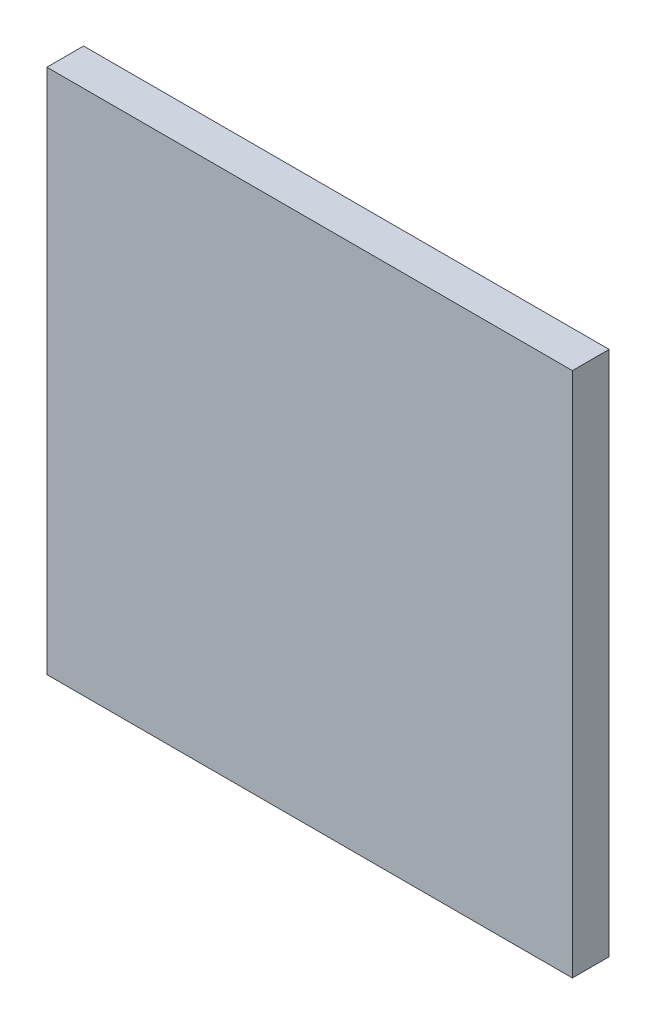
ISO-10303-21;
HEADER;
FILE_DESCRIPTION(('STEP AP214'),'2;1');
FILE_NAME('part.step','',(''),(''),'','','');
FILE_SCHEMA(('AUTOMOTIVE_DESIGN { 1 0 10303 214 1 1 1 1 }'));
ENDSEC;
DATA;
#1=APPLICATION_CONTEXT('core data for automotive mechanical design processes');
#2=APPLICATION_PROTOCOL_DEFINITION('international standard','automotive_design',2000,#1);
#3=PRODUCT_CONTEXT('',#1,'mechanical');
#4=PRODUCT('Part','Part','',(#3));
#5=PRODUCT_RELATED_PRODUCT_CATEGORY('part','',(#4));
#6=PRODUCT_DEFINITION_FORMATION('','',#4);
#7=PRODUCT_DEFINITION_CONTEXT('part definition',#1,'design');
#8=PRODUCT_DEFINITION('design','',#6,#7);
#9=PRODUCT_DEFINITION_SHAPE('','',#8);
#10=(LENGTH_UNIT() NAMED_UNIT(*) SI_UNIT(.MILLI.,.METRE.));
#11=(NAMED_UNIT(*) PLANE_ANGLE_UNIT() SI_UNIT($,.RADIAN.));
#12=(NAMED_UNIT(*) SI_UNIT($,.STERADIAN.) SOLID_ANGLE_UNIT());
#13=UNCERTAINTY_MEASURE_WITH_UNIT(LENGTH_MEASURE(1.E-05),#10,'distance_accuracy_value','');
#14=(GEOMETRIC_REPRESENTATION_CONTEXT(3) GLOBAL_UNCERTAINTY_ASSIGNED_CONTEXT((#13)) GLOBAL_UNIT_ASSIGNED_CONTEXT((#10,
#11,#12)) REPRESENTATION_CONTEXT('',''));
#15=CARTESIAN_POINT('',(0.,0.,0.));
#16=DIRECTION('',(0.,0.,1.));
#17=DIRECTION('',(1.,0.,0.));
#18=AXIS2_PLACEMENT_3D('',#15,#16,#17);
#19=CARTESIAN_POINT('',(1.655,0.8675,0.48));
#20=DIRECTION('',(0.,0.,1.));
#21=DIRECTION('',(1.,0.,0.));
#22=AXIS2_PLACEMENT_3D('',#19,#20,#21);
#23=PLANE('',#22);
#24=DIRECTION('',(0.,1.,0.));
#25=VECTOR('',#24,1.);
#26=CARTESIAN_POINT('',(6.665,0.8675,0.48));
#27=LINE('',#26,#25);
#28=CARTESIAN_POINT('',(6.665,5.8825,0.48));
#29=VERTEX_POINT('',#28);
#30=CARTESIAN_POINT('',(6.665,0.8675,0.48));
#31=VERTEX_POINT('',#30);
#32=EDGE_CURVE('E76',#29,#31,#27,.F.);
#33=ORIENTED_EDGE('',*,*,#32,.F.);
#34=DIRECTION('',(1.,0.,0.));
#35=VECTOR('',#34,1.);
#36=CARTESIAN_POINT('',(1.655,5.8825,0.48));
#37=LINE('',#36,#35);
#38=CARTESIAN_POINT('',(1.655,5.8825,0.48));
#39=VERTEX_POINT('',#38);
#40=EDGE_CURVE('E58',#39,#29,#37,.T.);
#41=ORIENTED_EDGE('',*,*,#40,.F.);
#42=DIRECTION('',(0.,1.,0.));
#43=VECTOR('',#42,1.);
#44=CARTESIAN_POINT('',(1.655,0.8675,0.48));
#45=LINE('',#44,#43);
#46=CARTESIAN_POINT('',(1.655,0.8675,0.48));
#47=VERTEX_POINT('',#46);
#48=EDGE_CURVE('E20',#39,#47,#45,.F.);
#49=ORIENTED_EDGE('',*,*,#48,.T.);
#50=DIRECTION('',(1.,0.,0.));
#51=VECTOR('',#50,1.);
#52=CARTESIAN_POINT('',(1.655,0.8675,0.48));
#53=LINE('',#52,#51);
#54=EDGE_CURVE('E55',#47,#31,#53,.T.);
#55=ORIENTED_EDGE('',*,*,#54,.T.);
#56=EDGE_LOOP('',(#33,#41,#49,#55));
#57=FACE_BOUND('',#56,.T.);
#58=ADVANCED_FACE('F17',(#57),#23,.T.);
#59=CARTESIAN_POINT('',(1.655,0.8675,0.13));
#60=DIRECTION('',(1.,0.,0.));
#61=DIRECTION('',(0.,0.,-1.));
#62=AXIS2_PLACEMENT_3D('',#59,#60,#61);
#63=PLANE('',#62);
#64=DIRECTION('',(0.,0.,1.));
#65=VECTOR('',#64,1.);
#66=CARTESIAN_POINT('',(1.655,5.8825,0.13));
#67=LINE('',#66,#65);
#68=CARTESIAN_POINT('',(1.655,5.8825,0.13));
#69=VERTEX_POINT('',#68);
#70=EDGE_CURVE('E78',#69,#39,#67,.T.);
#71=ORIENTED_EDGE('',*,*,#70,.F.);
#72=DIRECTION('',(0.,1.,0.));
#73=VECTOR('',#72,1.);
#74=CARTESIAN_POINT('',(1.655,0.8675,0.13));
#75=LINE('',#74,#73);
#76=CARTESIAN_POINT('',(1.655,0.8675,0.13));
#77=VERTEX_POINT('',#76);
#78=EDGE_CURVE('E73',#69,#77,#75,.F.);
#79=ORIENTED_EDGE('',*,*,#78,.T.);
#80=DIRECTION('',(0.,0.,1.));
#81=VECTOR('',#80,1.);
#82=CARTESIAN_POINT('',(1.655,0.8675,0.13));
#83=LINE('',#82,#81);
#84=EDGE_CURVE('E63',#77,#47,#83,.T.);
#85=ORIENTED_EDGE('',*,*,#84,.T.);
#86=ORIENTED_EDGE('',*,*,#48,.F.);
#87=EDGE_LOOP('',(#71,#79,#85,#86));
#88=FACE_BOUND('',#87,.T.);
#89=ADVANCED_FACE('F72',(#88),#63,.F.);
#90=CARTESIAN_POINT('',(1.655,0.8675,0.13));
#91=DIRECTION('',(0.,1.,0.));
#92=DIRECTION('',(0.,0.,1.));
#93=AXIS2_PLACEMENT_3D('',#90,#91,#92);
#94=PLANE('',#93);
#95=ORIENTED_EDGE('',*,*,#54,.F.);
#96=ORIENTED_EDGE('',*,*,#84,.F.);
#97=DIRECTION('',(1.,0.,0.));
#98=VECTOR('',#97,1.);
#99=CARTESIAN_POINT('',(1.655,0.8675,0.13));
#100=LINE('',#99,#98);
#101=CARTESIAN_POINT('',(6.665,0.8675,0.13));
#102=VERTEX_POINT('',#101);
#103=EDGE_CURVE('E83',#77,#102,#100,.T.);
#104=ORIENTED_EDGE('',*,*,#103,.T.);
#105=DIRECTION('',(0.,0.,-1.));
#106=VECTOR('',#105,1.);
#107=CARTESIAN_POINT('',(6.665,0.8675,0.13));
#108=LINE('',#107,#106);
#109=EDGE_CURVE('E69',#31,#102,#108,.T.);
#110=ORIENTED_EDGE('',*,*,#109,.F.);
#111=EDGE_LOOP('',(#95,#96,#104,#110));
#112=FACE_BOUND('',#111,.T.);
#113=ADVANCED_FACE('F66',(#112),#94,.F.);
#114=CARTESIAN_POINT('',(6.665,0.8675,0.13));
#115=DIRECTION('',(1.,0.,0.));
#116=DIRECTION('',(0.,0.,-1.));
#117=AXIS2_PLACEMENT_3D('',#114,#115,#116);
#118=PLANE('',#117);
#119=DIRECTION('',(0.,0.,1.));
#120=VECTOR('',#119,1.);
#121=CARTESIAN_POINT('',(6.665,5.8825,0.13));
#122=LINE('',#121,#120);
#123=CARTESIAN_POINT('',(6.665,5.8825,0.13));
#124=VERTEX_POINT('',#123);
#125=EDGE_CURVE('E34',#29,#124,#122,.F.);
#126=ORIENTED_EDGE('',*,*,#125,.F.);
#127=ORIENTED_EDGE('',*,*,#32,.T.);
#128=ORIENTED_EDGE('',*,*,#109,.T.);
#129=DIRECTION('',(0.,1.,0.));
#130=VECTOR('',#129,1.);
#131=CARTESIAN_POINT('',(6.665,0.8675,0.13));
#132=LINE('',#131,#130);
#133=EDGE_CURVE('E26',#102,#124,#132,.T.);
#134=ORIENTED_EDGE('',*,*,#133,.T.);
#135=EDGE_LOOP('',(#126,#127,#128,#134));
#136=FACE_BOUND('',#135,.T.);
#137=ADVANCED_FACE('F88',(#136),#118,.T.);
#138=CARTESIAN_POINT('',(1.655,5.8825,0.13));
#139=DIRECTION('',(0.,1.,0.));
#140=DIRECTION('',(0.,0.,1.));
#141=AXIS2_PLACEMENT_3D('',#138,#139,#140);
#142=PLANE('',#141);
#143=ORIENTED_EDGE('',*,*,#40,.T.);
#144=ORIENTED_EDGE('',*,*,#125,.T.);
#145=DIRECTION('',(1.,0.,0.));
#146=VECTOR('',#145,1.);
#147=CARTESIAN_POINT('',(1.655,5.8825,0.13));
#148=LINE('',#147,#146);
#149=EDGE_CURVE('E11',#124,#69,#148,.F.);
#150=ORIENTED_EDGE('',*,*,#149,.T.);
#151=ORIENTED_EDGE('',*,*,#70,.T.);
#152=EDGE_LOOP('',(#143,#144,#150,#151));
#153=FACE_BOUND('',#152,.T.);
#154=ADVANCED_FACE('F91',(#153),#142,.T.);
#155=CARTESIAN_POINT('',(1.655,0.8675,0.13));
#156=DIRECTION('',(0.,0.,1.));
#157=DIRECTION('',(1.,0.,0.));
#158=AXIS2_PLACEMENT_3D('',#155,#156,#157);
#159=PLANE('',#158);
#160=ORIENTED_EDGE('',*,*,#133,.F.);
#161=ORIENTED_EDGE('',*,*,#103,.F.);
#162=ORIENTED_EDGE('',*,*,#78,.F.);
#163=ORIENTED_EDGE('',*,*,#149,.F.);
#164=EDGE_LOOP('',(#160,#161,#162,#163));
#165=FACE_BOUND('',#164,.T.);
#166=ADVANCED_FACE('F90',(#165),#159,.F.);
#167=CLOSED_SHELL('',(#58,#89,#113,#137,#154,#166));
#168=MANIFOLD_SOLID_BREP('B1',#167);
#169=ADVANCED_BREP_SHAPE_REPRESENTATION('',(#18,#168),#14);
#170=SHAPE_DEFINITION_REPRESENTATION(#9,#169);
ENDSEC;
END-ISO-10303-21;
